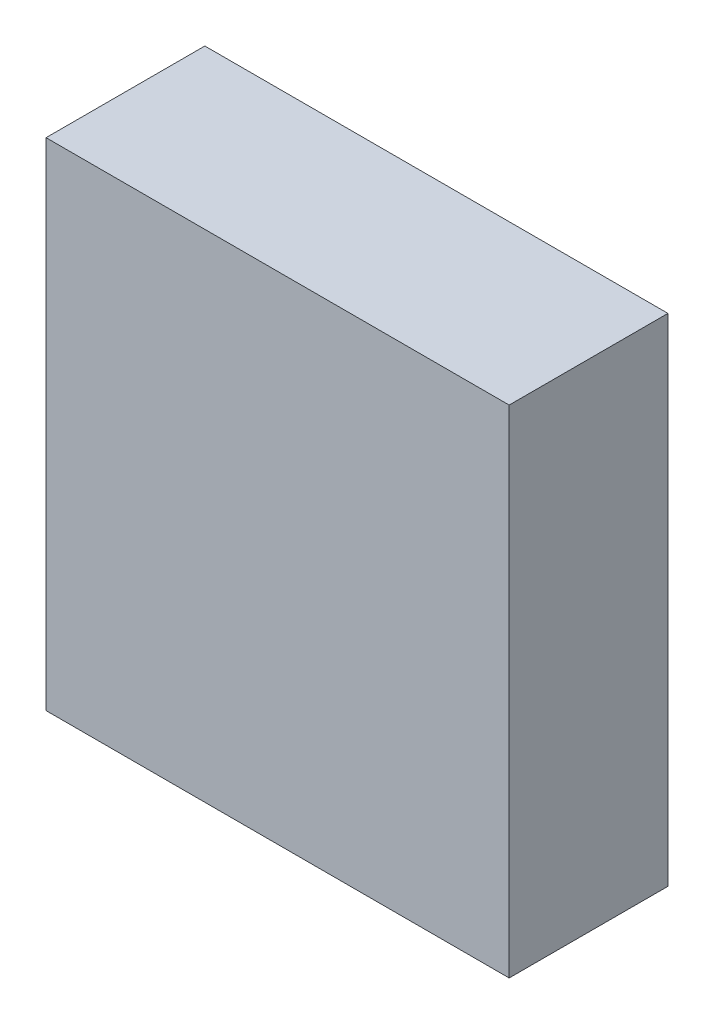
ISO-10303-21;
HEADER;
FILE_DESCRIPTION(('STEP AP214'),'2;1');
FILE_NAME('part.step','',(''),(''),'','','');
FILE_SCHEMA(('AUTOMOTIVE_DESIGN { 1 0 10303 214 1 1 1 1 }'));
ENDSEC;
DATA;
#1=APPLICATION_CONTEXT('core data for automotive mechanical design processes');
#2=APPLICATION_PROTOCOL_DEFINITION('international standard','automotive_design',2000,#1);
#3=PRODUCT_CONTEXT('',#1,'mechanical');
#4=PRODUCT('Part','Part','',(#3));
#5=PRODUCT_RELATED_PRODUCT_CATEGORY('part','',(#4));
#6=PRODUCT_DEFINITION_FORMATION('','',#4);
#7=PRODUCT_DEFINITION_CONTEXT('part definition',#1,'design');
#8=PRODUCT_DEFINITION('design','',#6,#7);
#9=PRODUCT_DEFINITION_SHAPE('','',#8);
#10=(LENGTH_UNIT() NAMED_UNIT(*) SI_UNIT(.MILLI.,.METRE.));
#11=(NAMED_UNIT(*) PLANE_ANGLE_UNIT() SI_UNIT($,.RADIAN.));
#12=(NAMED_UNIT(*) SI_UNIT($,.STERADIAN.) SOLID_ANGLE_UNIT());
#13=UNCERTAINTY_MEASURE_WITH_UNIT(LENGTH_MEASURE(1.E-05),#10,'distance_accuracy_value','');
#14=(GEOMETRIC_REPRESENTATION_CONTEXT(3) GLOBAL_UNCERTAINTY_ASSIGNED_CONTEXT((#13)) GLOBAL_UNIT_ASSIGNED_CONTEXT((#10,
#11,#12)) REPRESENTATION_CONTEXT('',''));
#15=CARTESIAN_POINT('',(0.,0.,0.));
#16=DIRECTION('',(0.,0.,1.));
#17=DIRECTION('',(1.,0.,0.));
#18=AXIS2_PLACEMENT_3D('',#15,#16,#17);
#19=CARTESIAN_POINT('',(2125.,1790.,1308.));
#20=DIRECTION('',(1.,0.,0.));
#21=DIRECTION('',(0.,0.,-1.));
#22=AXIS2_PLACEMENT_3D('',#19,#20,#21);
#23=PLANE('',#22);
#24=DIRECTION('',(0.,-1.,0.));
#25=VECTOR('',#24,1.);
#26=CARTESIAN_POINT('',(2125.,1790.,1068.));
#27=LINE('',#26,#25);
#28=CARTESIAN_POINT('',(2125.,1790.,1068.));
#29=VERTEX_POINT('',#28);
#30=CARTESIAN_POINT('',(2125.,1040.,1068.));
#31=VERTEX_POINT('',#30);
#32=EDGE_CURVE('E79',#29,#31,#27,.T.);
#33=ORIENTED_EDGE('',*,*,#32,.T.);
#34=DIRECTION('',(0.,0.,-1.));
#35=VECTOR('',#34,1.);
#36=CARTESIAN_POINT('',(2125.,1040.,1308.));
#37=LINE('',#36,#35);
#38=CARTESIAN_POINT('',(2125.,1040.,1308.));
#39=VERTEX_POINT('',#38);
#40=EDGE_CURVE('E11',#39,#31,#37,.T.);
#41=ORIENTED_EDGE('',*,*,#40,.F.);
#42=DIRECTION('',(0.,-1.,0.));
#43=VECTOR('',#42,1.);
#44=CARTESIAN_POINT('',(2125.,1790.,1308.));
#45=LINE('',#44,#43);
#46=CARTESIAN_POINT('',(2125.,1790.,1308.));
#47=VERTEX_POINT('',#46);
#48=EDGE_CURVE('E69',#47,#39,#45,.T.);
#49=ORIENTED_EDGE('',*,*,#48,.F.);
#50=DIRECTION('',(0.,0.,-1.));
#51=VECTOR('',#50,1.);
#52=CARTESIAN_POINT('',(2125.,1790.,1308.));
#53=LINE('',#52,#51);
#54=EDGE_CURVE('E20',#47,#29,#53,.T.);
#55=ORIENTED_EDGE('',*,*,#54,.T.);
#56=EDGE_LOOP('',(#33,#41,#49,#55));
#57=FACE_BOUND('',#56,.T.);
#58=ADVANCED_FACE('F17',(#57),#23,.F.);
#59=CARTESIAN_POINT('',(2125.,1040.,1308.));
#60=DIRECTION('',(0.,1.,0.));
#61=DIRECTION('',(0.,0.,1.));
#62=AXIS2_PLACEMENT_3D('',#59,#60,#61);
#63=PLANE('',#62);
#64=DIRECTION('',(1.,0.,0.));
#65=VECTOR('',#64,1.);
#66=CARTESIAN_POINT('',(2125.,1040.,1068.));
#67=LINE('',#66,#65);
#68=CARTESIAN_POINT('',(2825.,1040.,1068.));
#69=VERTEX_POINT('',#68);
#70=EDGE_CURVE('E50',#31,#69,#67,.T.);
#71=ORIENTED_EDGE('',*,*,#70,.T.);
#72=DIRECTION('',(0.,0.,-1.));
#73=VECTOR('',#72,1.);
#74=CARTESIAN_POINT('',(2825.,1040.,1308.));
#75=LINE('',#74,#73);
#76=CARTESIAN_POINT('',(2825.,1040.,1308.));
#77=VERTEX_POINT('',#76);
#78=EDGE_CURVE('E27',#77,#69,#75,.T.);
#79=ORIENTED_EDGE('',*,*,#78,.F.);
#80=DIRECTION('',(1.,0.,0.));
#81=VECTOR('',#80,1.);
#82=CARTESIAN_POINT('',(2125.,1040.,1308.));
#83=LINE('',#82,#81);
#84=EDGE_CURVE('E64',#39,#77,#83,.T.);
#85=ORIENTED_EDGE('',*,*,#84,.F.);
#86=ORIENTED_EDGE('',*,*,#40,.T.);
#87=EDGE_LOOP('',(#71,#79,#85,#86));
#88=FACE_BOUND('',#87,.T.);
#89=ADVANCED_FACE('F65',(#88),#63,.F.);
#90=CARTESIAN_POINT('',(2825.,1040.,1308.));
#91=DIRECTION('',(-1.,0.,0.));
#92=DIRECTION('',(0.,0.,1.));
#93=AXIS2_PLACEMENT_3D('',#90,#91,#92);
#94=PLANE('',#93);
#95=DIRECTION('',(0.,1.,0.));
#96=VECTOR('',#95,1.);
#97=CARTESIAN_POINT('',(2825.,1040.,1068.));
#98=LINE('',#97,#96);
#99=CARTESIAN_POINT('',(2825.,1790.,1068.));
#100=VERTEX_POINT('',#99);
#101=EDGE_CURVE('E56',#69,#100,#98,.T.);
#102=ORIENTED_EDGE('',*,*,#101,.T.);
#103=DIRECTION('',(0.,0.,-1.));
#104=VECTOR('',#103,1.);
#105=CARTESIAN_POINT('',(2825.,1790.,1308.));
#106=LINE('',#105,#104);
#107=CARTESIAN_POINT('',(2825.,1790.,1308.));
#108=VERTEX_POINT('',#107);
#109=EDGE_CURVE('E95',#108,#100,#106,.T.);
#110=ORIENTED_EDGE('',*,*,#109,.F.);
#111=DIRECTION('',(0.,1.,0.));
#112=VECTOR('',#111,1.);
#113=CARTESIAN_POINT('',(2825.,1040.,1308.));
#114=LINE('',#113,#112);
#115=EDGE_CURVE('E35',#77,#108,#114,.T.);
#116=ORIENTED_EDGE('',*,*,#115,.F.);
#117=ORIENTED_EDGE('',*,*,#78,.T.);
#118=EDGE_LOOP('',(#102,#110,#116,#117));
#119=FACE_BOUND('',#118,.T.);
#120=ADVANCED_FACE('F101',(#119),#94,.F.);
#121=CARTESIAN_POINT('',(2825.,1790.,1308.));
#122=DIRECTION('',(0.,-1.,0.));
#123=DIRECTION('',(0.,0.,-1.));
#124=AXIS2_PLACEMENT_3D('',#121,#122,#123);
#125=PLANE('',#124);
#126=DIRECTION('',(-1.,0.,0.));
#127=VECTOR('',#126,1.);
#128=CARTESIAN_POINT('',(2825.,1790.,1068.));
#129=LINE('',#128,#127);
#130=EDGE_CURVE('E76',#100,#29,#129,.T.);
#131=ORIENTED_EDGE('',*,*,#130,.T.);
#132=ORIENTED_EDGE('',*,*,#54,.F.);
#133=DIRECTION('',(-1.,0.,0.));
#134=VECTOR('',#133,1.);
#135=CARTESIAN_POINT('',(2825.,1790.,1308.));
#136=LINE('',#135,#134);
#137=EDGE_CURVE('E61',#108,#47,#136,.T.);
#138=ORIENTED_EDGE('',*,*,#137,.F.);
#139=ORIENTED_EDGE('',*,*,#109,.T.);
#140=EDGE_LOOP('',(#131,#132,#138,#139));
#141=FACE_BOUND('',#140,.T.);
#142=ADVANCED_FACE('F104',(#141),#125,.F.);
#143=CARTESIAN_POINT('',(0.,0.,1308.));
#144=DIRECTION('',(0.,0.,1.));
#145=DIRECTION('',(1.,0.,0.));
#146=AXIS2_PLACEMENT_3D('',#143,#144,#145);
#147=PLANE('',#146);
#148=ORIENTED_EDGE('',*,*,#48,.T.);
#149=ORIENTED_EDGE('',*,*,#84,.T.);
#150=ORIENTED_EDGE('',*,*,#115,.T.);
#151=ORIENTED_EDGE('',*,*,#137,.T.);
#152=EDGE_LOOP('',(#148,#149,#150,#151));
#153=FACE_BOUND('',#152,.T.);
#154=ADVANCED_FACE('F72',(#153),#147,.T.);
#155=CARTESIAN_POINT('',(0.,0.,1068.));
#156=DIRECTION('',(0.,0.,1.));
#157=DIRECTION('',(1.,0.,0.));
#158=AXIS2_PLACEMENT_3D('',#155,#156,#157);
#159=PLANE('',#158);
#160=ORIENTED_EDGE('',*,*,#32,.F.);
#161=ORIENTED_EDGE('',*,*,#130,.F.);
#162=ORIENTED_EDGE('',*,*,#101,.F.);
#163=ORIENTED_EDGE('',*,*,#70,.F.);
#164=EDGE_LOOP('',(#160,#161,#162,#163));
#165=FACE_BOUND('',#164,.T.);
#166=ADVANCED_FACE('F102',(#165),#159,.F.);
#167=CLOSED_SHELL('',(#58,#89,#120,#142,#154,#166));
#168=MANIFOLD_SOLID_BREP('B1',#167);
#169=ADVANCED_BREP_SHAPE_REPRESENTATION('',(#18,#168),#14);
#170=SHAPE_DEFINITION_REPRESENTATION(#9,#169);
ENDSEC;
END-ISO-10303-21;
